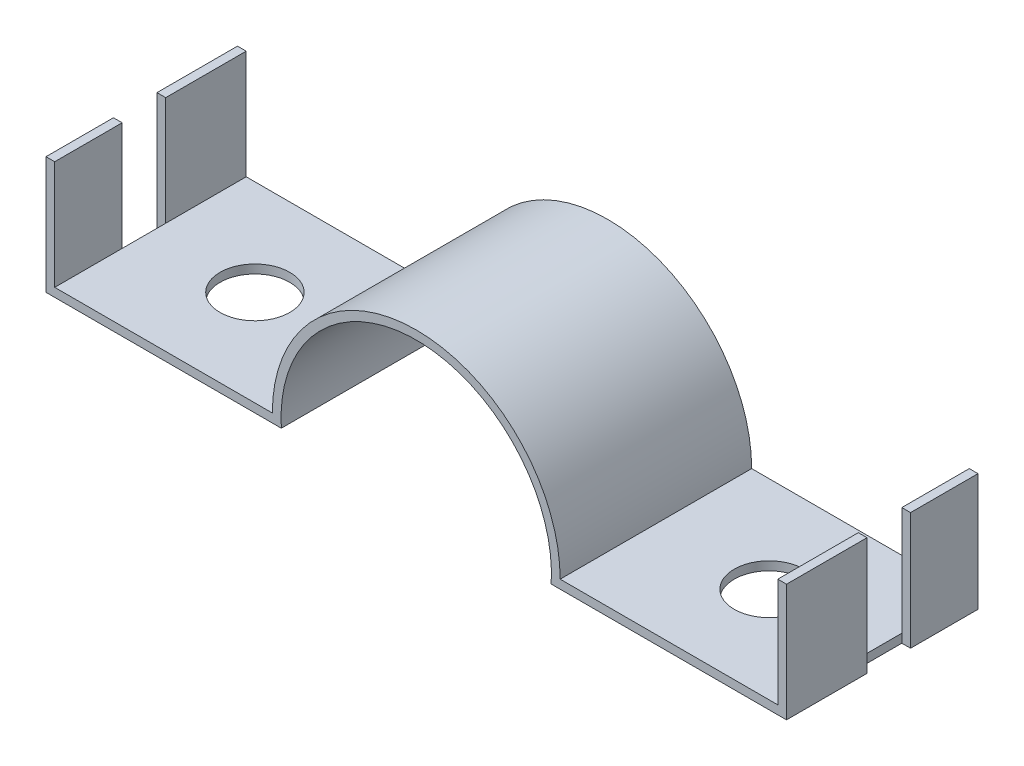
ISO-10303-21;
HEADER;
FILE_DESCRIPTION(('STEP AP214'),'2;1');
FILE_NAME('part.step','',(''),(''),'','','');
FILE_SCHEMA(('AUTOMOTIVE_DESIGN { 1 0 10303 214 1 1 1 1 }'));
ENDSEC;
DATA;
#1=APPLICATION_CONTEXT('core data for automotive mechanical design processes');
#2=APPLICATION_PROTOCOL_DEFINITION('international standard','automotive_design',2000,#1);
#3=PRODUCT_CONTEXT('',#1,'mechanical');
#4=PRODUCT('Part','Part','',(#3));
#5=PRODUCT_RELATED_PRODUCT_CATEGORY('part','',(#4));
#6=PRODUCT_DEFINITION_FORMATION('','',#4);
#7=PRODUCT_DEFINITION_CONTEXT('part definition',#1,'design');
#8=PRODUCT_DEFINITION('design','',#6,#7);
#9=PRODUCT_DEFINITION_SHAPE('','',#8);
#10=(LENGTH_UNIT() NAMED_UNIT(*) SI_UNIT(.MILLI.,.METRE.));
#11=(NAMED_UNIT(*) PLANE_ANGLE_UNIT() SI_UNIT($,.RADIAN.));
#12=(NAMED_UNIT(*) SI_UNIT($,.STERADIAN.) SOLID_ANGLE_UNIT());
#13=UNCERTAINTY_MEASURE_WITH_UNIT(LENGTH_MEASURE(1.E-05),#10,'distance_accuracy_value','');
#14=(GEOMETRIC_REPRESENTATION_CONTEXT(3) GLOBAL_UNCERTAINTY_ASSIGNED_CONTEXT((#13)) GLOBAL_UNIT_ASSIGNED_CONTEXT((#10,
#11,#12)) REPRESENTATION_CONTEXT('',''));
#15=CARTESIAN_POINT('',(0.,0.,0.));
#16=DIRECTION('',(0.,0.,1.));
#17=DIRECTION('',(1.,0.,0.));
#18=AXIS2_PLACEMENT_3D('',#15,#16,#17);
#19=CARTESIAN_POINT('',(-21.0983700800406,0.,11.176));
#20=DIRECTION('',(-1.,0.,0.));
#21=DIRECTION('',(0.,0.,1.));
#22=AXIS2_PLACEMENT_3D('',#19,#20,#21);
#23=PLANE('',#22);
#24=DIRECTION('',(0.,0.,-1.));
#25=VECTOR('',#24,1.);
#26=CARTESIAN_POINT('',(-21.0983700800406,6.35,11.176));
#27=LINE('',#26,#25);
#28=CARTESIAN_POINT('',(-21.0983700800406,6.35,4.699));
#29=VERTEX_POINT('',#28);
#30=CARTESIAN_POINT('',(-21.0983700800406,6.35,0.));
#31=VERTEX_POINT('',#30);
#32=EDGE_CURVE('E217',#29,#31,#27,.T.);
#33=ORIENTED_EDGE('',*,*,#32,.F.);
#34=DIRECTION('',(0.,1.,0.));
#35=VECTOR('',#34,1.);
#36=CARTESIAN_POINT('',(-21.0983700800406,-0.508000000000002,4.699));
#37=LINE('',#36,#35);
#38=CARTESIAN_POINT('',(-21.0983700800406,0.,4.699));
#39=VERTEX_POINT('',#38);
#40=EDGE_CURVE('E405',#39,#29,#37,.T.);
#41=ORIENTED_EDGE('',*,*,#40,.F.);
#42=DIRECTION('',(0.,0.,-1.));
#43=VECTOR('',#42,1.);
#44=CARTESIAN_POINT('',(-21.0983700800406,0.,11.176));
#45=LINE('',#44,#43);
#46=CARTESIAN_POINT('',(-21.0983700800406,0.,0.));
#47=VERTEX_POINT('',#46);
#48=EDGE_CURVE('E41',#39,#47,#45,.T.);
#49=ORIENTED_EDGE('',*,*,#48,.T.);
#50=DIRECTION('',(0.,1.,0.));
#51=VECTOR('',#50,1.);
#52=CARTESIAN_POINT('',(-21.0983700800406,0.,0.));
#53=LINE('',#52,#51);
#54=EDGE_CURVE('E234',#47,#31,#53,.T.);
#55=ORIENTED_EDGE('',*,*,#54,.T.);
#56=EDGE_LOOP('',(#33,#41,#49,#55));
#57=FACE_BOUND('',#56,.T.);
#58=ADVANCED_FACE('F33',(#57),#23,.F.);
#59=CARTESIAN_POINT('',(-21.0983700800406,6.35,11.176));
#60=DIRECTION('',(0.,-1.,0.));
#61=DIRECTION('',(0.,0.,-1.));
#62=AXIS2_PLACEMENT_3D('',#59,#60,#61);
#63=PLANE('',#62);
#64=DIRECTION('',(0.,0.,-1.));
#65=VECTOR('',#64,1.);
#66=CARTESIAN_POINT('',(-21.6063700800406,6.35,11.176));
#67=LINE('',#66,#65);
#68=CARTESIAN_POINT('',(-21.6063700800406,6.35,4.699));
#69=VERTEX_POINT('',#68);
#70=CARTESIAN_POINT('',(-21.6063700800406,6.35,0.));
#71=VERTEX_POINT('',#70);
#72=EDGE_CURVE('E210',#69,#71,#67,.T.);
#73=ORIENTED_EDGE('',*,*,#72,.F.);
#74=DIRECTION('',(-1.,0.,0.));
#75=VECTOR('',#74,1.);
#76=CARTESIAN_POINT('',(-13.7851106152055,6.35,4.699));
#77=LINE('',#76,#75);
#78=EDGE_CURVE('E184',#29,#69,#77,.T.);
#79=ORIENTED_EDGE('',*,*,#78,.F.);
#80=ORIENTED_EDGE('',*,*,#32,.T.);
#81=DIRECTION('',(-1.,0.,0.));
#82=VECTOR('',#81,1.);
#83=CARTESIAN_POINT('',(-21.0983700800406,6.35,0.));
#84=LINE('',#83,#82);
#85=EDGE_CURVE('E230',#31,#71,#84,.T.);
#86=ORIENTED_EDGE('',*,*,#85,.T.);
#87=EDGE_LOOP('',(#73,#79,#80,#86));
#88=FACE_BOUND('',#87,.T.);
#89=ADVANCED_FACE('F228',(#88),#63,.F.);
#90=CARTESIAN_POINT('',(-21.6063700800406,-0.508000000000002,11.176));
#91=DIRECTION('',(-1.,0.,0.));
#92=DIRECTION('',(0.,0.,1.));
#93=AXIS2_PLACEMENT_3D('',#90,#91,#92);
#94=PLANE('',#93);
#95=DIRECTION('',(0.,-1.,0.));
#96=VECTOR('',#95,1.);
#97=CARTESIAN_POINT('',(-21.6063700800406,-0.508000000000002,4.699));
#98=LINE('',#97,#96);
#99=CARTESIAN_POINT('',(-21.6063700800406,-0.508000000000002,4.699));
#100=VERTEX_POINT('',#99);
#101=EDGE_CURVE('E181',#69,#100,#98,.T.);
#102=ORIENTED_EDGE('',*,*,#101,.F.);
#103=ORIENTED_EDGE('',*,*,#72,.T.);
#104=DIRECTION('',(0.,1.,0.));
#105=VECTOR('',#104,1.);
#106=CARTESIAN_POINT('',(-21.6063700800406,-0.508000000000002,0.));
#107=LINE('',#106,#105);
#108=CARTESIAN_POINT('',(-21.6063700800406,-0.508000000000002,0.));
#109=VERTEX_POINT('',#108);
#110=EDGE_CURVE('E204',#109,#71,#107,.T.);
#111=ORIENTED_EDGE('',*,*,#110,.F.);
#112=DIRECTION('',(0.,0.,-1.));
#113=VECTOR('',#112,1.);
#114=CARTESIAN_POINT('',(-21.6063700800406,-0.508000000000002,11.176));
#115=LINE('',#114,#113);
#116=EDGE_CURVE('E195',#100,#109,#115,.T.);
#117=ORIENTED_EDGE('',*,*,#116,.F.);
#118=EDGE_LOOP('',(#102,#103,#111,#117));
#119=FACE_BOUND('',#118,.T.);
#120=ADVANCED_FACE('F202',(#119),#94,.T.);
#121=CARTESIAN_POINT('',(21.6063700800406,-0.508,11.176));
#122=DIRECTION('',(-1.,0.,0.));
#123=DIRECTION('',(0.,0.,1.));
#124=AXIS2_PLACEMENT_3D('',#121,#122,#123);
#125=PLANE('',#124);
#126=DIRECTION('',(0.,0.,-1.));
#127=VECTOR('',#126,1.);
#128=CARTESIAN_POINT('',(21.6063700800406,6.35,11.176));
#129=LINE('',#128,#127);
#130=CARTESIAN_POINT('',(21.6063700800406,6.35,3.937));
#131=VERTEX_POINT('',#130);
#132=CARTESIAN_POINT('',(21.6063700800406,6.35,0.));
#133=VERTEX_POINT('',#132);
#134=EDGE_CURVE('E283',#131,#133,#129,.T.);
#135=ORIENTED_EDGE('',*,*,#134,.F.);
#136=DIRECTION('',(0.,1.,0.));
#137=VECTOR('',#136,1.);
#138=CARTESIAN_POINT('',(21.6063700800406,-0.508,3.937));
#139=LINE('',#138,#137);
#140=CARTESIAN_POINT('',(21.6063700800406,-0.508,3.937));
#141=VERTEX_POINT('',#140);
#142=EDGE_CURVE('E308',#141,#131,#139,.T.);
#143=ORIENTED_EDGE('',*,*,#142,.F.);
#144=DIRECTION('',(0.,0.,-1.));
#145=VECTOR('',#144,1.);
#146=CARTESIAN_POINT('',(21.6063700800406,-0.508,11.176));
#147=LINE('',#146,#145);
#148=CARTESIAN_POINT('',(21.6063700800406,-0.508,0.));
#149=VERTEX_POINT('',#148);
#150=EDGE_CURVE('E287',#141,#149,#147,.T.);
#151=ORIENTED_EDGE('',*,*,#150,.T.);
#152=DIRECTION('',(0.,1.,0.));
#153=VECTOR('',#152,1.);
#154=CARTESIAN_POINT('',(21.6063700800406,-0.508,0.));
#155=LINE('',#154,#153);
#156=EDGE_CURVE('E253',#149,#133,#155,.T.);
#157=ORIENTED_EDGE('',*,*,#156,.T.);
#158=EDGE_LOOP('',(#135,#143,#151,#157));
#159=FACE_BOUND('',#158,.T.);
#160=ADVANCED_FACE('F306',(#159),#125,.F.);
#161=CARTESIAN_POINT('',(21.0983700800406,6.35,11.176));
#162=DIRECTION('',(0.,1.,0.));
#163=DIRECTION('',(0.,0.,1.));
#164=AXIS2_PLACEMENT_3D('',#161,#162,#163);
#165=PLANE('',#164);
#166=DIRECTION('',(1.,0.,0.));
#167=VECTOR('',#166,1.);
#168=CARTESIAN_POINT('',(13.7851106152055,6.35,3.937));
#169=LINE('',#168,#167);
#170=CARTESIAN_POINT('',(21.0983700800406,6.35,3.937));
#171=VERTEX_POINT('',#170);
#172=EDGE_CURVE('E322',#171,#131,#169,.T.);
#173=ORIENTED_EDGE('',*,*,#172,.T.);
#174=ORIENTED_EDGE('',*,*,#134,.T.);
#175=DIRECTION('',(1.,0.,0.));
#176=VECTOR('',#175,1.);
#177=CARTESIAN_POINT('',(21.0983700800406,6.35,0.));
#178=LINE('',#177,#176);
#179=CARTESIAN_POINT('',(21.0983700800406,6.35,0.));
#180=VERTEX_POINT('',#179);
#181=EDGE_CURVE('E256',#180,#133,#178,.T.);
#182=ORIENTED_EDGE('',*,*,#181,.F.);
#183=DIRECTION('',(0.,0.,-1.));
#184=VECTOR('',#183,1.);
#185=CARTESIAN_POINT('',(21.0983700800406,6.35,11.176));
#186=LINE('',#185,#184);
#187=EDGE_CURVE('E278',#171,#180,#186,.T.);
#188=ORIENTED_EDGE('',*,*,#187,.F.);
#189=EDGE_LOOP('',(#173,#174,#182,#188));
#190=FACE_BOUND('',#189,.T.);
#191=ADVANCED_FACE('F385',(#190),#165,.T.);
#192=CARTESIAN_POINT('',(21.0983700800406,0.,11.176));
#193=DIRECTION('',(-1.,0.,0.));
#194=DIRECTION('',(0.,0.,1.));
#195=AXIS2_PLACEMENT_3D('',#192,#193,#194);
#196=PLANE('',#195);
#197=DIRECTION('',(0.,1.,0.));
#198=VECTOR('',#197,1.);
#199=CARTESIAN_POINT('',(21.0983700800406,-0.508,3.937));
#200=LINE('',#199,#198);
#201=CARTESIAN_POINT('',(21.0983700800406,0.,3.937));
#202=VERTEX_POINT('',#201);
#203=EDGE_CURVE('E315',#202,#171,#200,.T.);
#204=ORIENTED_EDGE('',*,*,#203,.T.);
#205=ORIENTED_EDGE('',*,*,#187,.T.);
#206=DIRECTION('',(0.,1.,0.));
#207=VECTOR('',#206,1.);
#208=CARTESIAN_POINT('',(21.0983700800406,0.,0.));
#209=LINE('',#208,#207);
#210=CARTESIAN_POINT('',(21.0983700800406,0.,0.));
#211=VERTEX_POINT('',#210);
#212=EDGE_CURVE('E259',#211,#180,#209,.T.);
#213=ORIENTED_EDGE('',*,*,#212,.F.);
#214=DIRECTION('',(0.,0.,-1.));
#215=VECTOR('',#214,1.);
#216=CARTESIAN_POINT('',(21.0983700800406,0.,11.176));
#217=LINE('',#216,#215);
#218=EDGE_CURVE('E274',#202,#211,#217,.T.);
#219=ORIENTED_EDGE('',*,*,#218,.F.);
#220=EDGE_LOOP('',(#204,#205,#213,#219));
#221=FACE_BOUND('',#220,.T.);
#222=ADVANCED_FACE('F381',(#221),#196,.T.);
#223=CARTESIAN_POINT('',(-8.39837008004061,0.,11.176));
#224=DIRECTION('',(0.,-1.,0.));
#225=DIRECTION('',(1.,0.,0.));
#226=AXIS2_PLACEMENT_3D('',#223,#224,#225);
#227=PLANE('',#226);
#228=CARTESIAN_POINT('',(-15.0023700800406,0.,5.588));
#229=DIRECTION('',(0.,-1.,0.));
#230=DIRECTION('',(0.,0.,-1.));
#231=AXIS2_PLACEMENT_3D('',#228,#229,#230);
#232=CIRCLE('',#231,2.032);
#233=CARTESIAN_POINT('',(-15.0023700800406,0.,3.556));
#234=VERTEX_POINT('',#233);
#235=EDGE_CURVE('E331',#234,#234,#232,.T.);
#236=ORIENTED_EDGE('',*,*,#235,.T.);
#237=EDGE_LOOP('',(#236));
#238=FACE_BOUND('',#237,.T.);
#239=DIRECTION('',(-1.,0.,0.));
#240=VECTOR('',#239,1.);
#241=CARTESIAN_POINT('',(-8.39837008004061,0.,0.));
#242=LINE('',#241,#240);
#243=CARTESIAN_POINT('',(-8.39837008004061,0.,0.));
#244=VERTEX_POINT('',#243);
#245=EDGE_CURVE('E239',#244,#47,#242,.T.);
#246=ORIENTED_EDGE('',*,*,#245,.T.);
#247=ORIENTED_EDGE('',*,*,#48,.F.);
#248=DIRECTION('',(0.,0.,-1.));
#249=VECTOR('',#248,1.);
#250=CARTESIAN_POINT('',(-21.0983700800406,0.,11.176));
#251=LINE('',#250,#249);
#252=CARTESIAN_POINT('',(-21.0983700800406,0.,7.239));
#253=VERTEX_POINT('',#252);
#254=EDGE_CURVE('E393',#253,#39,#251,.T.);
#255=ORIENTED_EDGE('',*,*,#254,.F.);
#256=CARTESIAN_POINT('',(-21.0983700800406,0.,11.176));
#257=VERTEX_POINT('',#256);
#258=EDGE_CURVE('E11',#257,#253,#45,.T.);
#259=ORIENTED_EDGE('',*,*,#258,.F.);
#260=DIRECTION('',(-1.,0.,0.));
#261=VECTOR('',#260,1.);
#262=CARTESIAN_POINT('',(-8.39837008004061,0.,11.176));
#263=LINE('',#262,#261);
#264=CARTESIAN_POINT('',(-8.39837008004061,0.,11.176));
#265=VERTEX_POINT('',#264);
#266=EDGE_CURVE('E268',#265,#257,#263,.T.);
#267=ORIENTED_EDGE('',*,*,#266,.F.);
#268=DIRECTION('',(0.,0.,-1.));
#269=VECTOR('',#268,1.);
#270=CARTESIAN_POINT('',(-8.39837008004061,0.,11.176));
#271=LINE('',#270,#269);
#272=EDGE_CURVE('E269',#265,#244,#271,.T.);
#273=ORIENTED_EDGE('',*,*,#272,.T.);
#274=EDGE_LOOP('',(#246,#247,#255,#259,#267,#273));
#275=FACE_BOUND('',#274,.T.);
#276=ADVANCED_FACE('F35',(#238,#275),#227,.F.);
#277=ORIENTED_EDGE('',*,*,#258,.T.);
#278=DIRECTION('',(0.,-1.,0.));
#279=VECTOR('',#278,1.);
#280=CARTESIAN_POINT('',(-21.0983700800406,-0.508000000000002,7.239));
#281=LINE('',#280,#279);
#282=CARTESIAN_POINT('',(-21.0983700800406,6.35,7.239));
#283=VERTEX_POINT('',#282);
#284=EDGE_CURVE('E406',#283,#253,#281,.T.);
#285=ORIENTED_EDGE('',*,*,#284,.F.);
#286=CARTESIAN_POINT('',(-21.0983700800406,6.35,11.176));
#287=VERTEX_POINT('',#286);
#288=EDGE_CURVE('E218',#287,#283,#27,.T.);
#289=ORIENTED_EDGE('',*,*,#288,.F.);
#290=DIRECTION('',(0.,1.,0.));
#291=VECTOR('',#290,1.);
#292=CARTESIAN_POINT('',(-21.0983700800406,0.,11.176));
#293=LINE('',#292,#291);
#294=EDGE_CURVE('E341',#257,#287,#293,.T.);
#295=ORIENTED_EDGE('',*,*,#294,.F.);
#296=EDGE_LOOP('',(#277,#285,#289,#295));
#297=FACE_BOUND('',#296,.T.);
#298=ADVANCED_FACE('F423',(#297),#23,.F.);
#299=ORIENTED_EDGE('',*,*,#288,.T.);
#300=DIRECTION('',(-1.,0.,0.));
#301=VECTOR('',#300,1.);
#302=CARTESIAN_POINT('',(-13.7851106152055,6.35,7.239));
#303=LINE('',#302,#301);
#304=CARTESIAN_POINT('',(-21.6063700800406,6.35,7.239));
#305=VERTEX_POINT('',#304);
#306=EDGE_CURVE('E399',#283,#305,#303,.T.);
#307=ORIENTED_EDGE('',*,*,#306,.T.);
#308=CARTESIAN_POINT('',(-21.6063700800406,6.35,11.176));
#309=VERTEX_POINT('',#308);
#310=EDGE_CURVE('E215',#309,#305,#67,.T.);
#311=ORIENTED_EDGE('',*,*,#310,.F.);
#312=DIRECTION('',(-1.,0.,0.));
#313=VECTOR('',#312,1.);
#314=CARTESIAN_POINT('',(-21.0983700800406,6.35,11.176));
#315=LINE('',#314,#313);
#316=EDGE_CURVE('E343',#287,#309,#315,.T.);
#317=ORIENTED_EDGE('',*,*,#316,.F.);
#318=EDGE_LOOP('',(#299,#307,#311,#317));
#319=FACE_BOUND('',#318,.T.);
#320=ADVANCED_FACE('F421',(#319),#63,.F.);
#321=DIRECTION('',(0.,1.,0.));
#322=VECTOR('',#321,1.);
#323=CARTESIAN_POINT('',(-21.6063700800406,-0.508000000000002,7.239));
#324=LINE('',#323,#322);
#325=CARTESIAN_POINT('',(-21.6063700800406,-0.508000000000002,7.239));
#326=VERTEX_POINT('',#325);
#327=EDGE_CURVE('E188',#326,#305,#324,.T.);
#328=ORIENTED_EDGE('',*,*,#327,.F.);
#329=CARTESIAN_POINT('',(-21.6063700800406,-0.508000000000002,11.176));
#330=VERTEX_POINT('',#329);
#331=EDGE_CURVE('E206',#330,#326,#115,.T.);
#332=ORIENTED_EDGE('',*,*,#331,.F.);
#333=DIRECTION('',(0.,1.,0.));
#334=VECTOR('',#333,1.);
#335=CARTESIAN_POINT('',(-21.6063700800406,-0.508000000000002,11.176));
#336=LINE('',#335,#334);
#337=EDGE_CURVE('E345',#330,#309,#336,.T.);
#338=ORIENTED_EDGE('',*,*,#337,.T.);
#339=ORIENTED_EDGE('',*,*,#310,.T.);
#340=EDGE_LOOP('',(#328,#332,#338,#339));
#341=FACE_BOUND('',#340,.T.);
#342=ADVANCED_FACE('F417',(#341),#94,.T.);
#343=CARTESIAN_POINT('',(-7.874,-0.508,11.176));
#344=DIRECTION('',(0.,-1.,0.));
#345=DIRECTION('',(1.,0.,0.));
#346=AXIS2_PLACEMENT_3D('',#343,#344,#345);
#347=PLANE('',#346);
#348=DIRECTION('',(-1.,0.,0.));
#349=VECTOR('',#348,1.);
#350=CARTESIAN_POINT('',(-13.7851106152055,-0.508000000000002,4.699));
#351=LINE('',#350,#349);
#352=CARTESIAN_POINT('',(-21.0983700800406,-0.508000000000002,4.699));
#353=VERTEX_POINT('',#352);
#354=EDGE_CURVE('E48',#353,#100,#351,.T.);
#355=ORIENTED_EDGE('',*,*,#354,.T.);
#356=ORIENTED_EDGE('',*,*,#116,.T.);
#357=DIRECTION('',(-1.,0.,0.));
#358=VECTOR('',#357,1.);
#359=CARTESIAN_POINT('',(-7.874,-0.508,0.));
#360=LINE('',#359,#358);
#361=CARTESIAN_POINT('',(-7.874,-0.507999999999999,0.));
#362=VERTEX_POINT('',#361);
#363=EDGE_CURVE('E243',#362,#109,#360,.T.);
#364=ORIENTED_EDGE('',*,*,#363,.F.);
#365=DIRECTION('',(0.,0.,-1.));
#366=VECTOR('',#365,1.);
#367=CARTESIAN_POINT('',(-7.874,-0.507999999999999,11.176));
#368=LINE('',#367,#366);
#369=CARTESIAN_POINT('',(-7.874,-0.507999999999999,11.176));
#370=VERTEX_POINT('',#369);
#371=EDGE_CURVE('E207',#370,#362,#368,.T.);
#372=ORIENTED_EDGE('',*,*,#371,.F.);
#373=DIRECTION('',(-1.,0.,0.));
#374=VECTOR('',#373,1.);
#375=CARTESIAN_POINT('',(-7.874,-0.508,11.176));
#376=LINE('',#375,#374);
#377=EDGE_CURVE('E348',#370,#330,#376,.T.);
#378=ORIENTED_EDGE('',*,*,#377,.T.);
#379=ORIENTED_EDGE('',*,*,#331,.T.);
#380=DIRECTION('',(-1.,0.,0.));
#381=VECTOR('',#380,1.);
#382=CARTESIAN_POINT('',(-13.7851106152055,-0.508000000000002,7.239));
#383=LINE('',#382,#381);
#384=CARTESIAN_POINT('',(-21.0983700800406,-0.508000000000002,7.239));
#385=VERTEX_POINT('',#384);
#386=EDGE_CURVE('E200',#385,#326,#383,.T.);
#387=ORIENTED_EDGE('',*,*,#386,.F.);
#388=DIRECTION('',(0.,0.,-1.));
#389=VECTOR('',#388,1.);
#390=CARTESIAN_POINT('',(-21.0983700800406,-0.508000000000002,4.699));
#391=LINE('',#390,#389);
#392=EDGE_CURVE('E199',#385,#353,#391,.T.);
#393=ORIENTED_EDGE('',*,*,#392,.T.);
#394=EDGE_LOOP('',(#355,#356,#364,#372,#378,#379,#387,#393));
#395=FACE_BOUND('',#394,.T.);
#396=CARTESIAN_POINT('',(-15.0023700800406,-0.508000000000002,5.588));
#397=DIRECTION('',(0.,-1.,0.));
#398=DIRECTION('',(0.,0.,-1.));
#399=AXIS2_PLACEMENT_3D('',#396,#397,#398);
#400=CIRCLE('',#399,2.032);
#401=CARTESIAN_POINT('',(-15.0023700800406,-0.508000000000002,3.556));
#402=VERTEX_POINT('',#401);
#403=EDGE_CURVE('E328',#402,#402,#400,.T.);
#404=ORIENTED_EDGE('',*,*,#403,.F.);
#405=EDGE_LOOP('',(#404));
#406=FACE_BOUND('',#405,.T.);
#407=ADVANCED_FACE('F192',(#395,#406),#347,.T.);
#408=CARTESIAN_POINT('',(0.,0.,11.176));
#409=DIRECTION('',(0.,0.,-1.));
#410=DIRECTION('',(-1.,0.,0.));
#411=AXIS2_PLACEMENT_3D('',#408,#409,#410);
#412=CYLINDRICAL_SURFACE('',#411,7.89037008004061);
#413=CARTESIAN_POINT('',(0.,0.,0.));
#414=DIRECTION('',(0.,0.,-1.));
#415=DIRECTION('',(-1.,0.,0.));
#416=AXIS2_PLACEMENT_3D('',#413,#414,#415);
#417=CIRCLE('',#416,7.89037008004061);
#418=CARTESIAN_POINT('',(7.874,-0.508,0.));
#419=VERTEX_POINT('',#418);
#420=EDGE_CURVE('E248',#362,#419,#417,.T.);
#421=ORIENTED_EDGE('',*,*,#420,.T.);
#422=DIRECTION('',(0.,0.,-1.));
#423=VECTOR('',#422,1.);
#424=CARTESIAN_POINT('',(7.874,-0.508,11.176));
#425=LINE('',#424,#423);
#426=CARTESIAN_POINT('',(7.874,-0.508,11.176));
#427=VERTEX_POINT('',#426);
#428=EDGE_CURVE('E211',#427,#419,#425,.T.);
#429=ORIENTED_EDGE('',*,*,#428,.F.);
#430=CARTESIAN_POINT('',(0.,0.,11.176));
#431=DIRECTION('',(0.,0.,-1.));
#432=DIRECTION('',(-1.,0.,0.));
#433=AXIS2_PLACEMENT_3D('',#430,#431,#432);
#434=CIRCLE('',#433,7.89037008004061);
#435=EDGE_CURVE('E351',#370,#427,#434,.T.);
#436=ORIENTED_EDGE('',*,*,#435,.F.);
#437=ORIENTED_EDGE('',*,*,#371,.T.);
#438=EDGE_LOOP('',(#421,#429,#436,#437));
#439=FACE_BOUND('',#438,.T.);
#440=ADVANCED_FACE('F441',(#439),#412,.F.);
#441=CARTESIAN_POINT('',(7.874,-0.508,11.176));
#442=DIRECTION('',(0.,1.,0.));
#443=DIRECTION('',(0.,0.,1.));
#444=AXIS2_PLACEMENT_3D('',#441,#442,#443);
#445=PLANE('',#444);
#446=CARTESIAN_POINT('',(15.0023700800406,-0.508000000000002,5.588));
#447=DIRECTION('',(0.,1.,0.));
#448=DIRECTION('',(0.,0.,1.));
#449=AXIS2_PLACEMENT_3D('',#446,#447,#448);
#450=CIRCLE('',#449,2.032);
#451=CARTESIAN_POINT('',(15.0023700800406,-0.508000000000002,7.62));
#452=VERTEX_POINT('',#451);
#453=EDGE_CURVE('E326',#452,#452,#450,.T.);
#454=ORIENTED_EDGE('',*,*,#453,.T.);
#455=EDGE_LOOP('',(#454));
#456=FACE_BOUND('',#455,.T.);
#457=ORIENTED_EDGE('',*,*,#150,.F.);
#458=DIRECTION('',(1.,0.,0.));
#459=VECTOR('',#458,1.);
#460=CARTESIAN_POINT('',(13.7851106152055,-0.508,3.937));
#461=LINE('',#460,#459);
#462=CARTESIAN_POINT('',(21.0983700800406,-0.508,3.937));
#463=VERTEX_POINT('',#462);
#464=EDGE_CURVE('E311',#463,#141,#461,.T.);
#465=ORIENTED_EDGE('',*,*,#464,.F.);
#466=DIRECTION('',(0.,0.,-1.));
#467=VECTOR('',#466,1.);
#468=CARTESIAN_POINT('',(21.0983700800406,-0.508,6.477));
#469=LINE('',#468,#467);
#470=CARTESIAN_POINT('',(21.0983700800406,-0.508,6.477));
#471=VERTEX_POINT('',#470);
#472=EDGE_CURVE('E313',#471,#463,#469,.T.);
#473=ORIENTED_EDGE('',*,*,#472,.F.);
#474=DIRECTION('',(1.,0.,0.));
#475=VECTOR('',#474,1.);
#476=CARTESIAN_POINT('',(13.7851106152055,-0.508,6.477));
#477=LINE('',#476,#475);
#478=CARTESIAN_POINT('',(21.6063700800406,-0.508,6.477));
#479=VERTEX_POINT('',#478);
#480=EDGE_CURVE('E324',#471,#479,#477,.T.);
#481=ORIENTED_EDGE('',*,*,#480,.T.);
#482=CARTESIAN_POINT('',(21.6063700800406,-0.508,11.176));
#483=VERTEX_POINT('',#482);
#484=EDGE_CURVE('E288',#483,#479,#147,.T.);
#485=ORIENTED_EDGE('',*,*,#484,.F.);
#486=DIRECTION('',(1.,0.,0.));
#487=VECTOR('',#486,1.);
#488=CARTESIAN_POINT('',(7.874,-0.508,11.176));
#489=LINE('',#488,#487);
#490=EDGE_CURVE('E299',#427,#483,#489,.T.);
#491=ORIENTED_EDGE('',*,*,#490,.F.);
#492=ORIENTED_EDGE('',*,*,#428,.T.);
#493=DIRECTION('',(1.,0.,0.));
#494=VECTOR('',#493,1.);
#495=CARTESIAN_POINT('',(7.874,-0.508,0.));
#496=LINE('',#495,#494);
#497=EDGE_CURVE('E250',#419,#149,#496,.T.);
#498=ORIENTED_EDGE('',*,*,#497,.T.);
#499=EDGE_LOOP('',(#457,#465,#473,#481,#485,#491,#492,#498));
#500=FACE_BOUND('',#499,.T.);
#501=ADVANCED_FACE('F296',(#456,#500),#445,.F.);
#502=ORIENTED_EDGE('',*,*,#484,.T.);
#503=DIRECTION('',(0.,-1.,0.));
#504=VECTOR('',#503,1.);
#505=CARTESIAN_POINT('',(21.6063700800406,-0.508,6.477));
#506=LINE('',#505,#504);
#507=CARTESIAN_POINT('',(21.6063700800406,6.35,6.477));
#508=VERTEX_POINT('',#507);
#509=EDGE_CURVE('E391',#508,#479,#506,.T.);
#510=ORIENTED_EDGE('',*,*,#509,.F.);
#511=CARTESIAN_POINT('',(21.6063700800406,6.35,11.176));
#512=VERTEX_POINT('',#511);
#513=EDGE_CURVE('E284',#512,#508,#129,.T.);
#514=ORIENTED_EDGE('',*,*,#513,.F.);
#515=DIRECTION('',(0.,1.,0.));
#516=VECTOR('',#515,1.);
#517=CARTESIAN_POINT('',(21.6063700800406,-0.508,11.176));
#518=LINE('',#517,#516);
#519=EDGE_CURVE('E354',#483,#512,#518,.T.);
#520=ORIENTED_EDGE('',*,*,#519,.F.);
#521=EDGE_LOOP('',(#502,#510,#514,#520));
#522=FACE_BOUND('',#521,.T.);
#523=ADVANCED_FACE('F440',(#522),#125,.F.);
#524=DIRECTION('',(1.,0.,0.));
#525=VECTOR('',#524,1.);
#526=CARTESIAN_POINT('',(13.7851106152055,6.35,6.477));
#527=LINE('',#526,#525);
#528=CARTESIAN_POINT('',(21.0983700800406,6.35,6.477));
#529=VERTEX_POINT('',#528);
#530=EDGE_CURVE('E386',#529,#508,#527,.T.);
#531=ORIENTED_EDGE('',*,*,#530,.F.);
#532=CARTESIAN_POINT('',(21.0983700800406,6.35,11.176));
#533=VERTEX_POINT('',#532);
#534=EDGE_CURVE('E280',#533,#529,#186,.T.);
#535=ORIENTED_EDGE('',*,*,#534,.F.);
#536=DIRECTION('',(1.,0.,0.));
#537=VECTOR('',#536,1.);
#538=CARTESIAN_POINT('',(21.0983700800406,6.35,11.176));
#539=LINE('',#538,#537);
#540=EDGE_CURVE('E356',#533,#512,#539,.T.);
#541=ORIENTED_EDGE('',*,*,#540,.T.);
#542=ORIENTED_EDGE('',*,*,#513,.T.);
#543=EDGE_LOOP('',(#531,#535,#541,#542));
#544=FACE_BOUND('',#543,.T.);
#545=ADVANCED_FACE('F436',(#544),#165,.T.);
#546=DIRECTION('',(0.,-1.,0.));
#547=VECTOR('',#546,1.);
#548=CARTESIAN_POINT('',(21.0983700800406,-0.508,6.477));
#549=LINE('',#548,#547);
#550=CARTESIAN_POINT('',(21.0983700800406,0.,6.477));
#551=VERTEX_POINT('',#550);
#552=EDGE_CURVE('E327',#529,#551,#549,.T.);
#553=ORIENTED_EDGE('',*,*,#552,.T.);
#554=CARTESIAN_POINT('',(21.0983700800406,0.,11.176));
#555=VERTEX_POINT('',#554);
#556=EDGE_CURVE('E275',#555,#551,#217,.T.);
#557=ORIENTED_EDGE('',*,*,#556,.F.);
#558=DIRECTION('',(0.,1.,0.));
#559=VECTOR('',#558,1.);
#560=CARTESIAN_POINT('',(21.0983700800406,0.,11.176));
#561=LINE('',#560,#559);
#562=EDGE_CURVE('E359',#555,#533,#561,.T.);
#563=ORIENTED_EDGE('',*,*,#562,.T.);
#564=ORIENTED_EDGE('',*,*,#534,.T.);
#565=EDGE_LOOP('',(#553,#557,#563,#564));
#566=FACE_BOUND('',#565,.T.);
#567=ADVANCED_FACE('F428',(#566),#196,.T.);
#568=CARTESIAN_POINT('',(8.39837008004061,0.,11.176));
#569=DIRECTION('',(0.,1.,0.));
#570=DIRECTION('',(-1.,0.,0.));
#571=AXIS2_PLACEMENT_3D('',#568,#569,#570);
#572=PLANE('',#571);
#573=CARTESIAN_POINT('',(15.0023700800406,0.,5.588));
#574=DIRECTION('',(0.,1.,0.));
#575=DIRECTION('',(0.,0.,1.));
#576=AXIS2_PLACEMENT_3D('',#573,#574,#575);
#577=CIRCLE('',#576,2.032);
#578=CARTESIAN_POINT('',(15.0023700800406,0.,7.62));
#579=VERTEX_POINT('',#578);
#580=EDGE_CURVE('E334',#579,#579,#577,.T.);
#581=ORIENTED_EDGE('',*,*,#580,.F.);
#582=EDGE_LOOP('',(#581));
#583=FACE_BOUND('',#582,.T.);
#584=DIRECTION('',(1.,0.,0.));
#585=VECTOR('',#584,1.);
#586=CARTESIAN_POINT('',(8.39837008004061,0.,0.));
#587=LINE('',#586,#585);
#588=CARTESIAN_POINT('',(8.39837008004061,0.,0.));
#589=VERTEX_POINT('',#588);
#590=EDGE_CURVE('E262',#589,#211,#587,.T.);
#591=ORIENTED_EDGE('',*,*,#590,.F.);
#592=DIRECTION('',(0.,0.,-1.));
#593=VECTOR('',#592,1.);
#594=CARTESIAN_POINT('',(8.39837008004061,0.,11.176));
#595=LINE('',#594,#593);
#596=CARTESIAN_POINT('',(8.39837008004061,0.,11.176));
#597=VERTEX_POINT('',#596);
#598=EDGE_CURVE('E271',#597,#589,#595,.T.);
#599=ORIENTED_EDGE('',*,*,#598,.F.);
#600=DIRECTION('',(1.,0.,0.));
#601=VECTOR('',#600,1.);
#602=CARTESIAN_POINT('',(8.39837008004061,0.,11.176));
#603=LINE('',#602,#601);
#604=EDGE_CURVE('E362',#597,#555,#603,.T.);
#605=ORIENTED_EDGE('',*,*,#604,.T.);
#606=ORIENTED_EDGE('',*,*,#556,.T.);
#607=EDGE_CURVE('E279',#551,#202,#217,.T.);
#608=ORIENTED_EDGE('',*,*,#607,.T.);
#609=ORIENTED_EDGE('',*,*,#218,.T.);
#610=EDGE_LOOP('',(#591,#599,#605,#606,#608,#609));
#611=FACE_BOUND('',#610,.T.);
#612=ADVANCED_FACE('F376',(#583,#611),#572,.T.);
#613=CARTESIAN_POINT('',(0.,0.,11.176));
#614=DIRECTION('',(0.,0.,-1.));
#615=DIRECTION('',(-1.,0.,0.));
#616=AXIS2_PLACEMENT_3D('',#613,#614,#615);
#617=CYLINDRICAL_SURFACE('',#616,8.39837008004061);
#618=CARTESIAN_POINT('',(0.,0.,0.));
#619=DIRECTION('',(0.,0.,-1.));
#620=DIRECTION('',(-1.,0.,0.));
#621=AXIS2_PLACEMENT_3D('',#618,#619,#620);
#622=CIRCLE('',#621,8.39837008004061);
#623=EDGE_CURVE('E265',#244,#589,#622,.T.);
#624=ORIENTED_EDGE('',*,*,#623,.F.);
#625=ORIENTED_EDGE('',*,*,#272,.F.);
#626=CARTESIAN_POINT('',(0.,0.,11.176));
#627=DIRECTION('',(0.,0.,-1.));
#628=DIRECTION('',(-1.,0.,0.));
#629=AXIS2_PLACEMENT_3D('',#626,#627,#628);
#630=CIRCLE('',#629,8.39837008004061);
#631=EDGE_CURVE('E272',#265,#597,#630,.T.);
#632=ORIENTED_EDGE('',*,*,#631,.T.);
#633=ORIENTED_EDGE('',*,*,#598,.T.);
#634=EDGE_LOOP('',(#624,#625,#632,#633));
#635=FACE_BOUND('',#634,.T.);
#636=ADVANCED_FACE('F371',(#635),#617,.T.);
#637=CARTESIAN_POINT('',(0.,0.,11.176));
#638=DIRECTION('',(0.,0.,-1.));
#639=DIRECTION('',(-1.,0.,0.));
#640=AXIS2_PLACEMENT_3D('',#637,#638,#639);
#641=PLANE('',#640);
#642=ORIENTED_EDGE('',*,*,#266,.T.);
#643=ORIENTED_EDGE('',*,*,#294,.T.);
#644=ORIENTED_EDGE('',*,*,#316,.T.);
#645=ORIENTED_EDGE('',*,*,#337,.F.);
#646=ORIENTED_EDGE('',*,*,#377,.F.);
#647=ORIENTED_EDGE('',*,*,#435,.T.);
#648=ORIENTED_EDGE('',*,*,#490,.T.);
#649=ORIENTED_EDGE('',*,*,#519,.T.);
#650=ORIENTED_EDGE('',*,*,#540,.F.);
#651=ORIENTED_EDGE('',*,*,#562,.F.);
#652=ORIENTED_EDGE('',*,*,#604,.F.);
#653=ORIENTED_EDGE('',*,*,#631,.F.);
#654=EDGE_LOOP('',(#642,#643,#644,#645,#646,#647,#648,#649,#650,#651,#652,#653));
#655=FACE_BOUND('',#654,.T.);
#656=ADVANCED_FACE('F419',(#655),#641,.F.);
#657=CARTESIAN_POINT('',(0.,0.,0.));
#658=DIRECTION('',(0.,0.,-1.));
#659=DIRECTION('',(-1.,0.,0.));
#660=AXIS2_PLACEMENT_3D('',#657,#658,#659);
#661=PLANE('',#660);
#662=ORIENTED_EDGE('',*,*,#245,.F.);
#663=ORIENTED_EDGE('',*,*,#623,.T.);
#664=ORIENTED_EDGE('',*,*,#590,.T.);
#665=ORIENTED_EDGE('',*,*,#212,.T.);
#666=ORIENTED_EDGE('',*,*,#181,.T.);
#667=ORIENTED_EDGE('',*,*,#156,.F.);
#668=ORIENTED_EDGE('',*,*,#497,.F.);
#669=ORIENTED_EDGE('',*,*,#420,.F.);
#670=ORIENTED_EDGE('',*,*,#363,.T.);
#671=ORIENTED_EDGE('',*,*,#110,.T.);
#672=ORIENTED_EDGE('',*,*,#85,.F.);
#673=ORIENTED_EDGE('',*,*,#54,.F.);
#674=EDGE_LOOP('',(#662,#663,#664,#665,#666,#667,#668,#669,#670,#671,#672,#673));
#675=FACE_BOUND('',#674,.T.);
#676=ADVANCED_FACE('F241',(#675),#661,.T.);
#677=CARTESIAN_POINT('',(15.0023700800406,-0.508000000000002,5.588));
#678=DIRECTION('',(0.,1.,0.));
#679=DIRECTION('',(0.,0.,1.));
#680=AXIS2_PLACEMENT_3D('',#677,#678,#679);
#681=CYLINDRICAL_SURFACE('',#680,2.032);
#682=ORIENTED_EDGE('',*,*,#453,.F.);
#683=EDGE_LOOP('',(#682));
#684=FACE_BOUND('',#683,.T.);
#685=ORIENTED_EDGE('',*,*,#580,.T.);
#686=EDGE_LOOP('',(#685));
#687=FACE_BOUND('',#686,.T.);
#688=ADVANCED_FACE('F471',(#684,#687),#681,.F.);
#689=CARTESIAN_POINT('',(-15.0023700800406,-0.508000000000002,5.588));
#690=DIRECTION('',(0.,1.,0.));
#691=DIRECTION('',(0.,0.,1.));
#692=AXIS2_PLACEMENT_3D('',#689,#690,#691);
#693=CYLINDRICAL_SURFACE('',#692,2.032);
#694=ORIENTED_EDGE('',*,*,#403,.T.);
#695=EDGE_LOOP('',(#694));
#696=FACE_BOUND('',#695,.T.);
#697=ORIENTED_EDGE('',*,*,#235,.F.);
#698=EDGE_LOOP('',(#697));
#699=FACE_BOUND('',#698,.T.);
#700=ADVANCED_FACE('F468',(#696,#699),#693,.F.);
#701=CARTESIAN_POINT('',(21.0983700800406,0.,11.176));
#702=DIRECTION('',(-1.,0.,0.));
#703=DIRECTION('',(0.,0.,1.));
#704=AXIS2_PLACEMENT_3D('',#701,#702,#703);
#705=PLANE('',#704);
#706=ORIENTED_EDGE('',*,*,#607,.F.);
#707=EDGE_CURVE('E387',#551,#471,#549,.T.);
#708=ORIENTED_EDGE('',*,*,#707,.T.);
#709=ORIENTED_EDGE('',*,*,#472,.T.);
#710=EDGE_CURVE('E56',#463,#202,#200,.T.);
#711=ORIENTED_EDGE('',*,*,#710,.T.);
#712=EDGE_LOOP('',(#706,#708,#709,#711));
#713=FACE_BOUND('',#712,.T.);
#714=ADVANCED_FACE('F470',(#713),#705,.F.);
#715=CARTESIAN_POINT('',(13.7851106152055,-0.508,3.937));
#716=DIRECTION('',(0.,0.,-1.));
#717=DIRECTION('',(0.,1.,0.));
#718=AXIS2_PLACEMENT_3D('',#715,#716,#717);
#719=PLANE('',#718);
#720=ORIENTED_EDGE('',*,*,#464,.T.);
#721=ORIENTED_EDGE('',*,*,#142,.T.);
#722=ORIENTED_EDGE('',*,*,#172,.F.);
#723=ORIENTED_EDGE('',*,*,#203,.F.);
#724=ORIENTED_EDGE('',*,*,#710,.F.);
#725=EDGE_LOOP('',(#720,#721,#722,#723,#724));
#726=FACE_BOUND('',#725,.T.);
#727=ADVANCED_FACE('F478',(#726),#719,.F.);
#728=CARTESIAN_POINT('',(13.7851106152055,-0.508,6.477));
#729=DIRECTION('',(0.,0.,1.));
#730=DIRECTION('',(1.,0.,0.));
#731=AXIS2_PLACEMENT_3D('',#728,#729,#730);
#732=PLANE('',#731);
#733=ORIENTED_EDGE('',*,*,#530,.T.);
#734=ORIENTED_EDGE('',*,*,#509,.T.);
#735=ORIENTED_EDGE('',*,*,#480,.F.);
#736=ORIENTED_EDGE('',*,*,#707,.F.);
#737=ORIENTED_EDGE('',*,*,#552,.F.);
#738=EDGE_LOOP('',(#733,#734,#735,#736,#737));
#739=FACE_BOUND('',#738,.T.);
#740=ADVANCED_FACE('F432',(#739),#732,.F.);
#741=CARTESIAN_POINT('',(-21.0983700800406,0.,11.176));
#742=DIRECTION('',(-1.,0.,0.));
#743=DIRECTION('',(0.,0.,1.));
#744=AXIS2_PLACEMENT_3D('',#741,#742,#743);
#745=PLANE('',#744);
#746=ORIENTED_EDGE('',*,*,#254,.T.);
#747=EDGE_CURVE('E396',#353,#39,#37,.T.);
#748=ORIENTED_EDGE('',*,*,#747,.F.);
#749=ORIENTED_EDGE('',*,*,#392,.F.);
#750=EDGE_CURVE('E402',#253,#385,#281,.T.);
#751=ORIENTED_EDGE('',*,*,#750,.F.);
#752=EDGE_LOOP('',(#746,#748,#749,#751));
#753=FACE_BOUND('',#752,.T.);
#754=ADVANCED_FACE('F413',(#753),#745,.T.);
#755=CARTESIAN_POINT('',(-13.7851106152055,-0.508000000000002,4.699));
#756=DIRECTION('',(0.,0.,-1.));
#757=DIRECTION('',(-1.,0.,0.));
#758=AXIS2_PLACEMENT_3D('',#755,#756,#757);
#759=PLANE('',#758);
#760=ORIENTED_EDGE('',*,*,#747,.T.);
#761=ORIENTED_EDGE('',*,*,#40,.T.);
#762=ORIENTED_EDGE('',*,*,#78,.T.);
#763=ORIENTED_EDGE('',*,*,#101,.T.);
#764=ORIENTED_EDGE('',*,*,#354,.F.);
#765=EDGE_LOOP('',(#760,#761,#762,#763,#764));
#766=FACE_BOUND('',#765,.T.);
#767=ADVANCED_FACE('F182',(#766),#759,.F.);
#768=CARTESIAN_POINT('',(-13.7851106152055,-0.508000000000002,7.239));
#769=DIRECTION('',(0.,0.,1.));
#770=DIRECTION('',(0.,-1.,0.));
#771=AXIS2_PLACEMENT_3D('',#768,#769,#770);
#772=PLANE('',#771);
#773=ORIENTED_EDGE('',*,*,#284,.T.);
#774=ORIENTED_EDGE('',*,*,#750,.T.);
#775=ORIENTED_EDGE('',*,*,#386,.T.);
#776=ORIENTED_EDGE('',*,*,#327,.T.);
#777=ORIENTED_EDGE('',*,*,#306,.F.);
#778=EDGE_LOOP('',(#773,#774,#775,#776,#777));
#779=FACE_BOUND('',#778,.T.);
#780=ADVANCED_FACE('F410',(#779),#772,.F.);
#781=CLOSED_SHELL('',(#58,#89,#120,#160,#191,#222,#276,#298,#320,#342,#407,#440,#501,#523,#545,
#567,#612,#636,#656,#676,#688,#700,#714,#727,#740,#754,#767,#780));
#782=MANIFOLD_SOLID_BREP('B2',#781);
#783=ADVANCED_BREP_SHAPE_REPRESENTATION('',(#18,#782),#14);
#784=SHAPE_DEFINITION_REPRESENTATION(#9,#783);
ENDSEC;
END-ISO-10303-21;
